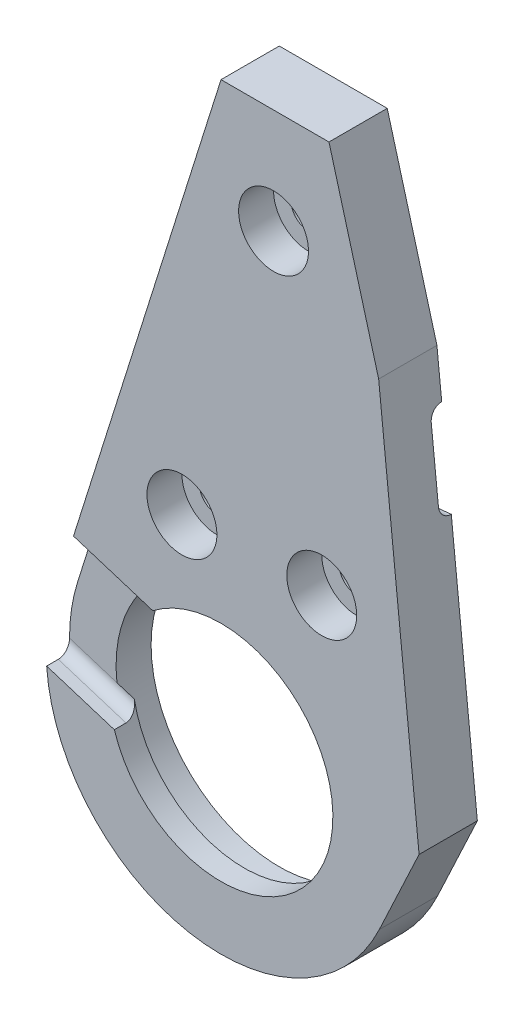
ISO-10303-21;
HEADER;
FILE_DESCRIPTION(('STEP AP214'),'2;1');
FILE_NAME('part.step','',(''),(''),'','','');
FILE_SCHEMA(('AUTOMOTIVE_DESIGN { 1 0 10303 214 1 1 1 1 }'));
ENDSEC;
DATA;
#1=APPLICATION_CONTEXT('core data for automotive mechanical design processes');
#2=APPLICATION_PROTOCOL_DEFINITION('international standard','automotive_design',2000,#1);
#3=PRODUCT_CONTEXT('',#1,'mechanical');
#4=PRODUCT('Part','Part','',(#3));
#5=PRODUCT_RELATED_PRODUCT_CATEGORY('part','',(#4));
#6=PRODUCT_DEFINITION_FORMATION('','',#4);
#7=PRODUCT_DEFINITION_CONTEXT('part definition',#1,'design');
#8=PRODUCT_DEFINITION('design','',#6,#7);
#9=PRODUCT_DEFINITION_SHAPE('','',#8);
#10=(LENGTH_UNIT() NAMED_UNIT(*) SI_UNIT(.MILLI.,.METRE.));
#11=(NAMED_UNIT(*) PLANE_ANGLE_UNIT() SI_UNIT($,.RADIAN.));
#12=(NAMED_UNIT(*) SI_UNIT($,.STERADIAN.) SOLID_ANGLE_UNIT());
#13=UNCERTAINTY_MEASURE_WITH_UNIT(LENGTH_MEASURE(1.E-05),#10,'distance_accuracy_value','');
#14=(GEOMETRIC_REPRESENTATION_CONTEXT(3) GLOBAL_UNCERTAINTY_ASSIGNED_CONTEXT((#13)) GLOBAL_UNIT_ASSIGNED_CONTEXT((#10,
#11,#12)) REPRESENTATION_CONTEXT('',''));
#15=CARTESIAN_POINT('',(0.,0.,0.));
#16=DIRECTION('',(0.,0.,1.));
#17=DIRECTION('',(1.,0.,0.));
#18=AXIS2_PLACEMENT_3D('',#15,#16,#17);
#19=CARTESIAN_POINT('',(-20.,-50.,-31.));
#20=DIRECTION('',(0.,0.,-1.));
#21=DIRECTION('',(-1.,0.,0.));
#22=AXIS2_PLACEMENT_3D('',#19,#20,#21);
#23=PLANE('',#22);
#24=CARTESIAN_POINT('',(-20.,-50.,-31.));
#25=DIRECTION('',(0.,0.,-1.));
#26=DIRECTION('',(-1.,0.,0.));
#27=AXIS2_PLACEMENT_3D('',#24,#25,#26);
#28=CIRCLE('',#27,9.6);
#29=CARTESIAN_POINT('',(-29.4393819294184,-51.7487334818578,-31.));
#30=VERTEX_POINT('',#29);
#31=CARTESIAN_POINT('',(-26.7393819294183,-43.1632806691053,-31.));
#32=VERTEX_POINT('',#31);
#33=EDGE_CURVE('E40',#30,#32,#28,.F.);
#34=ORIENTED_EDGE('',*,*,#33,.T.);
#35=DIRECTION('',(-0.953939201416946,0.3,0.));
#36=VECTOR('',#35,1.);
#37=CARTESIAN_POINT('',(22.058254426158,-58.5094273469315,-31.));
#38=LINE('',#37,#36);
#39=CARTESIAN_POINT('',(-28.2250979107265,-42.696044608641,-31.));
#40=VERTEX_POINT('',#39);
#41=EDGE_CURVE('E335',#32,#40,#38,.T.);
#42=ORIENTED_EDGE('',*,*,#41,.T.);
#43=CARTESIAN_POINT('',(-20.,-50.,-31.));
#44=DIRECTION('',(0.,0.,-1.));
#45=DIRECTION('',(-1.,0.,0.));
#46=AXIS2_PLACEMENT_3D('',#43,#44,#45);
#47=CIRCLE('',#46,11.);
#48=CARTESIAN_POINT('',(-30.9250979107266,-51.2814974213935,-31.));
#49=VERTEX_POINT('',#48);
#50=EDGE_CURVE('E384',#40,#49,#47,.T.);
#51=ORIENTED_EDGE('',*,*,#50,.T.);
#52=DIRECTION('',(-0.953939201416946,0.3,0.));
#53=VECTOR('',#52,1.);
#54=CARTESIAN_POINT('',(19.358254426158,-67.094880159684,-31.));
#55=LINE('',#54,#53);
#56=EDGE_CURVE('E53',#30,#49,#55,.T.);
#57=ORIENTED_EDGE('',*,*,#56,.F.);
#58=EDGE_LOOP('',(#34,#42,#51,#57));
#59=FACE_BOUND('',#58,.T.);
#60=ADVANCED_FACE('F36',(#59),#23,.T.);
#61=CARTESIAN_POINT('',(-20.,-50.,-60.));
#62=DIRECTION('',(0.,0.,1.));
#63=DIRECTION('',(1.,0.,0.));
#64=AXIS2_PLACEMENT_3D('',#61,#62,#63);
#65=CYLINDRICAL_SURFACE('',#64,9.6);
#66=CARTESIAN_POINT('',(-20.,-50.,-29.));
#67=DIRECTION('',(0.,0.,1.));
#68=DIRECTION('',(1.,0.,0.));
#69=AXIS2_PLACEMENT_3D('',#66,#67,#68);
#70=CIRCLE('',#69,9.6);
#71=CARTESIAN_POINT('',(-29.1558710353962,-52.8861783699543,-29.));
#72=VERTEX_POINT('',#71);
#73=CARTESIAN_POINT('',(-25.8558710353962,-42.3928471543679,-29.));
#74=VERTEX_POINT('',#73);
#75=EDGE_CURVE('E379',#72,#74,#70,.T.);
#76=ORIENTED_EDGE('',*,*,#75,.T.);
#77=DIRECTION('',(0.,0.,1.));
#78=VECTOR('',#77,1.);
#79=CARTESIAN_POINT('',(-25.8558710353962,-42.3928471543679,-60.));
#80=LINE('',#79,#78);
#81=CARTESIAN_POINT('',(-25.8558710353962,-42.392847154368,-30.));
#82=VERTEX_POINT('',#81);
#83=EDGE_CURVE('E182',#82,#74,#80,.T.);
#84=ORIENTED_EDGE('',*,*,#83,.F.);
#85=CARTESIAN_POINT('',(-26.7393819294183,-43.1632806691053,-31.));
#86=CARTESIAN_POINT('',(-26.708953104435,-43.1332824363248,-30.9999934591604));
#87=CARTESIAN_POINT('',(-26.6783480417263,-43.1035171265237,-30.9978619232937));
#88=CARTESIAN_POINT('',(-26.6170424007395,-43.0446745806458,-30.9894227469912));
#89=CARTESIAN_POINT('',(-26.586341808724,-43.0155974492457,-30.9831144754195));
#90=CARTESIAN_POINT('',(-26.4943659498825,-42.9296235328799,-30.9580008290302));
#91=CARTESIAN_POINT('',(-26.4333483392297,-42.874113842024,-30.9330072450578));
#92=CARTESIAN_POINT('',(-26.3237138627346,-42.7767576676922,-30.8721701775931));
#93=CARTESIAN_POINT('',(-26.2745972863862,-42.73410445976,-30.8384769358854));
#94=CARTESIAN_POINT('',(-26.1809863395571,-42.6543098408112,-30.760104370251));
#95=CARTESIAN_POINT('',(-26.1364802268708,-42.6171543190125,-30.7154539823377));
#96=CARTESIAN_POINT('',(-26.0638762374925,-42.5574808481338,-30.6272126941645));
#97=CARTESIAN_POINT('',(-26.0343572337536,-42.5335608163591,-30.5857323932424));
#98=CARTESIAN_POINT('',(-25.9807624535497,-42.4905619501602,-30.4970518295208));
#99=CARTESIAN_POINT('',(-25.9566869245982,-42.4714833358694,-30.4498513067738));
#100=CARTESIAN_POINT('',(-25.9152732084242,-42.4388989501857,-30.3502415033072));
#101=CARTESIAN_POINT('',(-25.8979941538528,-42.4254420301849,-30.2977912808445));
#102=CARTESIAN_POINT('',(-25.8718938975677,-42.4051896507866,-30.1896591472928));
#103=CARTESIAN_POINT('',(-25.8630474725039,-42.3983743239422,-30.1339874055727));
#104=CARTESIAN_POINT('',(-25.8578275418393,-42.3943536944394,-30.0649259233837));
#105=CARTESIAN_POINT('',(-25.8570939616421,-42.3937887322924,-30.0519499067012));
#106=CARTESIAN_POINT('',(-25.8561166134675,-42.3930361215307,-30.0259845921508));
#107=CARTESIAN_POINT('',(-25.8558722402626,-42.3928480066952,-30.0129953306092));
#108=CARTESIAN_POINT('',(-25.8558710353962,-42.3928471543679,-30.));
#109=B_SPLINE_CURVE_WITH_KNOTS('',3,(#85,#86,#87,#88,#89,#90,#91,#92,#93,#94,#95,#96,#97,#98,
#99,#100,#101,#102,#103,#104,#105,#106,#107,#108),.UNSPECIFIED.,.F.,.F.,(4,2,2,2,2,2,2,2,2,2,2,
4),(0.,0.128062400157063,0.256144155916194,0.512852722613334,0.731610673755789,0.9497970234836,
1.11788710607632,1.28598483015154,1.45551434343712,1.62453516057251,1.66355368064658,
1.70252389864426),.UNSPECIFIED.);
#110=EDGE_CURVE('E179',#32,#82,#109,.T.);
#111=ORIENTED_EDGE('',*,*,#110,.F.);
#112=ORIENTED_EDGE('',*,*,#33,.F.);
#113=CARTESIAN_POINT('',(-29.1558710353962,-52.8861783699543,-30.));
#114=CARTESIAN_POINT('',(-29.1558694981825,-52.8861810822079,-30.0247431489206));
#115=CARTESIAN_POINT('',(-29.156208220782,-52.8851089057417,-30.0494725114879));
#116=CARTESIAN_POINT('',(-29.157549089381,-52.8808509612997,-30.0987179073384));
#117=CARTESIAN_POINT('',(-29.1585508918658,-52.8776662877207,-30.1232340444259));
#118=CARTESIAN_POINT('',(-29.1625080213248,-52.8650528503457,-30.195895599995));
#119=CARTESIAN_POINT('',(-29.166415562616,-52.8525635613928,-30.2434913535337));
#120=CARTESIAN_POINT('',(-29.1764317266943,-52.8201741674065,-30.3356902574583));
#121=CARTESIAN_POINT('',(-29.1825366278895,-52.8002865906971,-30.3802983173884));
#122=CARTESIAN_POINT('',(-29.1965069068441,-52.7540593424347,-30.4657830378397));
#123=CARTESIAN_POINT('',(-29.2043746669144,-52.7277109351855,-30.5066545425771));
#124=CARTESIAN_POINT('',(-29.2220398813542,-52.6674027465966,-30.586938376665));
#125=CARTESIAN_POINT('',(-29.2319381452055,-52.633018666701,-30.626007912492));
#126=CARTESIAN_POINT('',(-29.2526848383426,-52.5591594082589,-30.6986694694454));
#127=CARTESIAN_POINT('',(-29.2635335440177,-52.5196827471983,-30.7322598890591));
#128=CARTESIAN_POINT('',(-29.2876329857231,-52.4294861268328,-30.7990271223231));
#129=CARTESIAN_POINT('',(-29.3009757534088,-52.3780004958367,-30.8311375327768));
#130=CARTESIAN_POINT('',(-29.3277321432008,-52.2707888228381,-30.8872654516292));
#131=CARTESIAN_POINT('',(-29.3411458174143,-52.2150590814562,-30.9112757983088));
#132=CARTESIAN_POINT('',(-29.3694454593169,-52.0923570146426,-30.9537982945056));
#133=CARTESIAN_POINT('',(-29.3842659105742,-52.0249201257417,-30.9710240433074));
#134=CARTESIAN_POINT('',(-29.4127926070912,-51.8879548885575,-30.9941204049947));
#135=CARTESIAN_POINT('',(-29.4264996264197,-51.8184280401121,-30.999998972404));
#136=CARTESIAN_POINT('',(-29.4393819294183,-51.7487334818578,-31.));
#137=B_SPLINE_CURVE_WITH_KNOTS('',3,(#113,#114,#115,#116,#117,#118,#119,#120,#121,#122,#123,
#124,#125,#126,#127,#128,#129,#130,#131,#132,#133,#134,#135,#136),.UNSPECIFIED.,.F.,.F.,(4,2,2,
2,2,2,2,2,2,2,2,4),(0.,0.0741774489505457,0.148316499633982,0.295597564020698,0.44263034837933,
0.589863042885926,0.748205012196815,0.906593181298909,1.09224427613172,1.27805908789319,
1.49058303425076,1.70295794433287),.UNSPECIFIED.);
#138=CARTESIAN_POINT('',(-29.1558710353962,-52.8861783699543,-30.));
#139=VERTEX_POINT('',#138);
#140=EDGE_CURVE('E159',#139,#30,#137,.T.);
#141=ORIENTED_EDGE('',*,*,#140,.F.);
#142=DIRECTION('',(0.,0.,1.));
#143=VECTOR('',#142,1.);
#144=CARTESIAN_POINT('',(-29.1558710353962,-52.8861783699543,-60.));
#145=LINE('',#144,#143);
#146=EDGE_CURVE('E167',#72,#139,#145,.F.);
#147=ORIENTED_EDGE('',*,*,#146,.F.);
#148=EDGE_LOOP('',(#76,#84,#111,#112,#141,#147));
#149=FACE_BOUND('',#148,.T.);
#150=ADVANCED_FACE('F176',(#149),#65,.F.);
#151=CARTESIAN_POINT('',(-20.,-50.,43.448064082473));
#152=DIRECTION('',(0.,0.,-1.));
#153=DIRECTION('',(-1.,0.,0.));
#154=AXIS2_PLACEMENT_3D('',#151,#152,#153);
#155=CYLINDRICAL_SURFACE('',#154,15.);
#156=CARTESIAN_POINT('',(-35.,-50.,-31.));
#157=CARTESIAN_POINT('',(-35.0000146091624,-50.0618934252655,-31.0000324406078));
#158=CARTESIAN_POINT('',(-34.9996173264148,-50.1237688856559,-30.994772656085));
#159=CARTESIAN_POINT('',(-34.9981063748224,-50.2457885596002,-30.9740340516693));
#160=CARTESIAN_POINT('',(-34.9969925679375,-50.305932437227,-30.9585532626587));
#161=CARTESIAN_POINT('',(-34.9941553951178,-50.4227951455116,-30.9177290114465));
#162=CARTESIAN_POINT('',(-34.9924317509404,-50.4795123988944,-30.892381046744));
#163=CARTESIAN_POINT('',(-34.9885764254946,-50.5877967106704,-30.8324215746637));
#164=CARTESIAN_POINT('',(-34.986444865533,-50.6393652932656,-30.7978128200637));
#165=CARTESIAN_POINT('',(-34.982055432017,-50.7350400899605,-30.7206435726129));
#166=CARTESIAN_POINT('',(-34.979799620821,-50.7792366090757,-30.6781952184562));
#167=CARTESIAN_POINT('',(-34.9754155511114,-50.8593859843174,-30.5860817249478));
#168=CARTESIAN_POINT('',(-34.9732872857094,-50.8953392859273,-30.5364169758246));
#169=CARTESIAN_POINT('',(-34.9695468581534,-50.9557916678516,-30.4341500841833));
#170=CARTESIAN_POINT('',(-34.9679129685171,-50.9808061282078,-30.3818532428068));
#171=CARTESIAN_POINT('',(-34.9652259305991,-51.02099196968,-30.2736284140995));
#172=CARTESIAN_POINT('',(-34.9641718360279,-51.0361793967884,-30.2177065110609));
#173=CARTESIAN_POINT('',(-34.9631524929805,-51.0507548220827,-30.1343496040528));
#174=CARTESIAN_POINT('',(-34.9629063075052,-51.0542497643536,-30.1075821063431));
#175=CARTESIAN_POINT('',(-34.9625770191807,-51.0589108343465,-30.0538813810222));
#176=CARTESIAN_POINT('',(-34.9624936920082,-51.0600801654385,-30.0269484327081));
#177=CARTESIAN_POINT('',(-34.9624941314541,-51.0600798867073,-30.));
#178=B_SPLINE_CURVE_WITH_KNOTS('',3,(#156,#157,#158,#159,#160,#161,#162,#163,#164,#165,#166,
#167,#168,#169,#170,#171,#172,#173,#174,#175,#176,#177),.UNSPECIFIED.,.F.,.F.,(4,2,2,2,2,2,2,2,
2,2,4),(0.,0.185433339833314,0.370902414575588,0.556456220295377,0.741954931139815,
0.92498110236649,1.10799738008258,1.28108983741606,1.4538989440874,1.53479982440294,
1.6155891919015),.UNSPECIFIED.);
#179=CARTESIAN_POINT('',(-35.,-50.,-31.));
#180=VERTEX_POINT('',#179);
#181=CARTESIAN_POINT('',(-34.9624941314541,-51.0600798867073,-30.));
#182=VERTEX_POINT('',#181);
#183=EDGE_CURVE('E161',#180,#182,#178,.T.);
#184=ORIENTED_EDGE('',*,*,#183,.F.);
#185=CARTESIAN_POINT('',(-20.,-50.,-31.));
#186=DIRECTION('',(0.,0.,-1.));
#187=DIRECTION('',(0.,1.,0.));
#188=AXIS2_PLACEMENT_3D('',#185,#186,#187);
#189=CIRCLE('',#188,15.);
#190=CARTESIAN_POINT('',(-34.3090880212542,-45.5,-31.));
#191=VERTEX_POINT('',#190);
#192=EDGE_CURVE('E173',#191,#180,#189,.F.);
#193=ORIENTED_EDGE('',*,*,#192,.F.);
#194=DIRECTION('',(0.,0.,-1.));
#195=VECTOR('',#194,1.);
#196=CARTESIAN_POINT('',(-34.3090880212542,-45.5,43.448064082473));
#197=LINE('',#196,#195);
#198=CARTESIAN_POINT('',(-34.3090880212542,-45.5,-34.));
#199=VERTEX_POINT('',#198);
#200=EDGE_CURVE('E346',#191,#199,#197,.T.);
#201=ORIENTED_EDGE('',*,*,#200,.T.);
#202=CARTESIAN_POINT('',(-20.,-50.,-34.));
#203=DIRECTION('',(0.,0.,1.));
#204=DIRECTION('',(1.,0.,0.));
#205=AXIS2_PLACEMENT_3D('',#202,#203,#204);
#206=CIRCLE('',#205,15.);
#207=CARTESIAN_POINT('',(-6.41777475793713,-56.3657801936503,-34.));
#208=VERTEX_POINT('',#207);
#209=EDGE_CURVE('E367',#199,#208,#206,.T.);
#210=ORIENTED_EDGE('',*,*,#209,.T.);
#211=DIRECTION('',(0.,0.,-1.));
#212=VECTOR('',#211,1.);
#213=CARTESIAN_POINT('',(-6.41777475793713,-56.3657801936503,43.448064082473));
#214=LINE('',#213,#212);
#215=CARTESIAN_POINT('',(-6.41777475793713,-56.3657801936503,-29.));
#216=VERTEX_POINT('',#215);
#217=EDGE_CURVE('E364',#216,#208,#214,.T.);
#218=ORIENTED_EDGE('',*,*,#217,.F.);
#219=CARTESIAN_POINT('',(-20.,-50.,-29.));
#220=DIRECTION('',(0.,0.,1.));
#221=DIRECTION('',(1.,0.,0.));
#222=AXIS2_PLACEMENT_3D('',#219,#220,#221);
#223=CIRCLE('',#222,15.);
#224=CARTESIAN_POINT('',(-34.9624941314541,-51.0600798867073,-29.));
#225=VERTEX_POINT('',#224);
#226=EDGE_CURVE('E355',#225,#216,#223,.T.);
#227=ORIENTED_EDGE('',*,*,#226,.F.);
#228=DIRECTION('',(0.,0.,-1.));
#229=VECTOR('',#228,1.);
#230=CARTESIAN_POINT('',(-34.9624941314541,-51.0600798867073,43.448064082473));
#231=LINE('',#230,#229);
#232=EDGE_CURVE('E298',#182,#225,#231,.F.);
#233=ORIENTED_EDGE('',*,*,#232,.F.);
#234=EDGE_LOOP('',(#184,#193,#201,#210,#218,#227,#233));
#235=FACE_BOUND('',#234,.T.);
#236=ADVANCED_FACE('F266',(#235),#155,.T.);
#237=CARTESIAN_POINT('',(-3.00434421209489,-49.0827793498556,43.448064082473));
#238=DIRECTION('',(-0.905481682804191,0.424385346243353,0.));
#239=DIRECTION('',(-0.424385346243353,-0.905481682804191,0.));
#240=AXIS2_PLACEMENT_3D('',#237,#238,#239);
#241=PLANE('',#240);
#242=DIRECTION('',(0.424385346243353,0.905481682804191,0.));
#243=VECTOR('',#242,1.);
#244=CARTESIAN_POINT('',(-3.00434421209489,-49.0827793498556,-29.));
#245=LINE('',#244,#243);
#246=CARTESIAN_POINT('',(-3.00434421209489,-49.0827793498556,-29.));
#247=VERTEX_POINT('',#246);
#248=EDGE_CURVE('E358',#216,#247,#245,.T.);
#249=ORIENTED_EDGE('',*,*,#248,.F.);
#250=ORIENTED_EDGE('',*,*,#217,.T.);
#251=DIRECTION('',(0.424385346243353,0.905481682804191,0.));
#252=VECTOR('',#251,1.);
#253=CARTESIAN_POINT('',(-3.00434421209489,-49.0827793498556,-34.));
#254=LINE('',#253,#252);
#255=CARTESIAN_POINT('',(-3.00434421209489,-49.0827793498556,-34.));
#256=VERTEX_POINT('',#255);
#257=EDGE_CURVE('E366',#208,#256,#254,.T.);
#258=ORIENTED_EDGE('',*,*,#257,.T.);
#259=DIRECTION('',(0.,0.,-1.));
#260=VECTOR('',#259,1.);
#261=CARTESIAN_POINT('',(-3.00434421209489,-49.0827793498556,43.448064082473));
#262=LINE('',#261,#260);
#263=EDGE_CURVE('E368',#247,#256,#262,.T.);
#264=ORIENTED_EDGE('',*,*,#263,.F.);
#265=EDGE_LOOP('',(#249,#250,#258,#264));
#266=FACE_BOUND('',#265,.T.);
#267=ADVANCED_FACE('F286',(#266),#241,.F.);
#268=CARTESIAN_POINT('',(-6.47298154426952,-15.4820474382701,43.448064082473));
#269=DIRECTION('',(-0.994713891574881,-0.102685314957669,0.));
#270=DIRECTION('',(0.102685314957669,-0.994713891574881,0.));
#271=AXIS2_PLACEMENT_3D('',#268,#269,#270);
#272=PLANE('',#271);
#273=DIRECTION('',(-0.102685314957669,0.994713891574881,0.));
#274=VECTOR('',#273,1.);
#275=CARTESIAN_POINT('',(-6.47298154426952,-15.4820474382701,-34.));
#276=LINE('',#275,#274);
#277=CARTESIAN_POINT('',(-5.24075776477749,-27.4186141371687,-34.));
#278=VERTEX_POINT('',#277);
#279=EDGE_CURVE('E375',#256,#278,#276,.T.);
#280=ORIENTED_EDGE('',*,*,#279,.T.);
#281=CARTESIAN_POINT('',(-5.34344307973516,-26.4239002455938,-34.));
#282=DIRECTION('',(0.994713891574881,0.102685314957669,0.));
#283=DIRECTION('',(0.102685314957669,-0.994713891574881,0.));
#284=AXIS2_PLACEMENT_3D('',#281,#282,#283);
#285=CIRCLE('',#284,1.);
#286=CARTESIAN_POINT('',(-5.34344307973516,-26.4239002455938,-33.));
#287=VERTEX_POINT('',#286);
#288=EDGE_CURVE('E415',#287,#278,#285,.T.);
#289=ORIENTED_EDGE('',*,*,#288,.F.);
#290=DIRECTION('',(-0.102685314957669,0.994713891574881,0.));
#291=VECTOR('',#290,1.);
#292=CARTESIAN_POINT('',(-5.24075776477749,-27.4186141371687,-33.));
#293=LINE('',#292,#291);
#294=CARTESIAN_POINT('',(-5.95955496948118,-20.4556168961445,-33.));
#295=VERTEX_POINT('',#294);
#296=EDGE_CURVE('E441',#287,#295,#293,.T.);
#297=ORIENTED_EDGE('',*,*,#296,.T.);
#298=CARTESIAN_POINT('',(-5.95955496948118,-20.4556168961445,-34.));
#299=DIRECTION('',(0.994713891574881,0.102685314957669,0.));
#300=DIRECTION('',(0.102685314957669,-0.994713891574881,0.));
#301=AXIS2_PLACEMENT_3D('',#298,#299,#300);
#302=CIRCLE('',#301,1.);
#303=CARTESIAN_POINT('',(-6.06224028443885,-19.4609030045697,-34.));
#304=VERTEX_POINT('',#303);
#305=EDGE_CURVE('E489',#304,#295,#302,.T.);
#306=ORIENTED_EDGE('',*,*,#305,.F.);
#307=CARTESIAN_POINT('',(-6.47298154426952,-15.4820474382701,-34.));
#308=VERTEX_POINT('',#307);
#309=EDGE_CURVE('E370',#304,#308,#276,.T.);
#310=ORIENTED_EDGE('',*,*,#309,.T.);
#311=DIRECTION('',(0.,0.,-1.));
#312=VECTOR('',#311,1.);
#313=CARTESIAN_POINT('',(-6.47298154426952,-15.4820474382701,43.448064082473));
#314=LINE('',#313,#312);
#315=CARTESIAN_POINT('',(-6.47298154426952,-15.4820474382701,-29.));
#316=VERTEX_POINT('',#315);
#317=EDGE_CURVE('E371',#316,#308,#314,.T.);
#318=ORIENTED_EDGE('',*,*,#317,.F.);
#319=DIRECTION('',(-0.102685314957669,0.994713891574881,0.));
#320=VECTOR('',#319,1.);
#321=CARTESIAN_POINT('',(-6.47298154426952,-15.4820474382701,-29.));
#322=LINE('',#321,#320);
#323=EDGE_CURVE('E398',#247,#316,#322,.T.);
#324=ORIENTED_EDGE('',*,*,#323,.F.);
#325=ORIENTED_EDGE('',*,*,#263,.T.);
#326=EDGE_LOOP('',(#280,#289,#297,#306,#310,#318,#324,#325));
#327=FACE_BOUND('',#326,.T.);
#328=ADVANCED_FACE('F282',(#327),#272,.F.);
#329=CARTESIAN_POINT('',(-10.7364907721348,0.,43.448064082473));
#330=DIRECTION('',(-0.964110662190105,-0.265500717609871,0.));
#331=DIRECTION('',(0.265500717609871,-0.964110662190105,0.));
#332=AXIS2_PLACEMENT_3D('',#329,#330,#331);
#333=PLANE('',#332);
#334=DIRECTION('',(-0.265500717609871,0.964110662190105,0.));
#335=VECTOR('',#334,1.);
#336=CARTESIAN_POINT('',(-10.7364907721348,0.,-29.));
#337=LINE('',#336,#335);
#338=CARTESIAN_POINT('',(-10.7364907721348,0.,-29.));
#339=VERTEX_POINT('',#338);
#340=EDGE_CURVE('E45',#316,#339,#337,.T.);
#341=ORIENTED_EDGE('',*,*,#340,.F.);
#342=ORIENTED_EDGE('',*,*,#317,.T.);
#343=DIRECTION('',(-0.265500717609871,0.964110662190105,0.));
#344=VECTOR('',#343,1.);
#345=CARTESIAN_POINT('',(-10.7364907721348,0.,-34.));
#346=LINE('',#345,#344);
#347=CARTESIAN_POINT('',(-10.7364907721348,0.,-34.));
#348=VERTEX_POINT('',#347);
#349=EDGE_CURVE('E374',#308,#348,#346,.T.);
#350=ORIENTED_EDGE('',*,*,#349,.T.);
#351=DIRECTION('',(0.,0.,-1.));
#352=VECTOR('',#351,1.);
#353=CARTESIAN_POINT('',(-10.7364907721348,0.,43.448064082473));
#354=LINE('',#353,#352);
#355=EDGE_CURVE('E376',#339,#348,#354,.T.);
#356=ORIENTED_EDGE('',*,*,#355,.F.);
#357=EDGE_LOOP('',(#341,#342,#350,#356));
#358=FACE_BOUND('',#357,.T.);
#359=ADVANCED_FACE('F278',(#358),#333,.F.);
#360=CARTESIAN_POINT('',(-20.,0.,43.448064082473));
#361=DIRECTION('',(0.,-1.,0.));
#362=DIRECTION('',(0.,0.,-1.));
#363=AXIS2_PLACEMENT_3D('',#360,#361,#362);
#364=PLANE('',#363);
#365=DIRECTION('',(-1.,0.,0.));
#366=VECTOR('',#365,1.);
#367=CARTESIAN_POINT('',(-20.,0.,-29.));
#368=LINE('',#367,#366);
#369=CARTESIAN_POINT('',(-20.,0.,-29.));
#370=VERTEX_POINT('',#369);
#371=EDGE_CURVE('E11',#339,#370,#368,.T.);
#372=ORIENTED_EDGE('',*,*,#371,.F.);
#373=ORIENTED_EDGE('',*,*,#355,.T.);
#374=DIRECTION('',(-1.,0.,0.));
#375=VECTOR('',#374,1.);
#376=CARTESIAN_POINT('',(-20.,0.,-34.));
#377=LINE('',#376,#375);
#378=CARTESIAN_POINT('',(-20.,0.,-34.));
#379=VERTEX_POINT('',#378);
#380=EDGE_CURVE('E378',#348,#379,#377,.T.);
#381=ORIENTED_EDGE('',*,*,#380,.T.);
#382=DIRECTION('',(0.,0.,-1.));
#383=VECTOR('',#382,1.);
#384=CARTESIAN_POINT('',(-20.,0.,43.448064082473));
#385=LINE('',#384,#383);
#386=EDGE_CURVE('E360',#370,#379,#385,.T.);
#387=ORIENTED_EDGE('',*,*,#386,.F.);
#388=EDGE_LOOP('',(#372,#373,#381,#387));
#389=FACE_BOUND('',#388,.T.);
#390=ADVANCED_FACE('F274',(#389),#364,.F.);
#391=CARTESIAN_POINT('',(-34.3090880212542,-45.5,43.448064082473));
#392=DIRECTION('',(0.953939201416946,-0.3,0.));
#393=DIRECTION('',(0.3,0.953939201416946,0.));
#394=AXIS2_PLACEMENT_3D('',#391,#392,#393);
#395=PLANE('',#394);
#396=CARTESIAN_POINT('',(-32.9590880212542,-41.2072735936237,-30.));
#397=DIRECTION('',(-0.953939201416946,0.3,0.));
#398=DIRECTION('',(0.3,0.953939201416946,0.));
#399=AXIS2_PLACEMENT_3D('',#396,#397,#398);
#400=CIRCLE('',#399,1.);
#401=CARTESIAN_POINT('',(-32.6590880212542,-40.2533343922068,-30.));
#402=VERTEX_POINT('',#401);
#403=CARTESIAN_POINT('',(-32.9590880212542,-41.2072735936237,-31.));
#404=VERTEX_POINT('',#403);
#405=EDGE_CURVE('E339',#402,#404,#400,.T.);
#406=ORIENTED_EDGE('',*,*,#405,.F.);
#407=DIRECTION('',(0.,0.,-1.));
#408=VECTOR('',#407,1.);
#409=CARTESIAN_POINT('',(-32.6590880212542,-40.2533343922068,-30.));
#410=LINE('',#409,#408);
#411=CARTESIAN_POINT('',(-32.6590880212542,-40.2533343922068,-29.));
#412=VERTEX_POINT('',#411);
#413=EDGE_CURVE('E343',#412,#402,#410,.T.);
#414=ORIENTED_EDGE('',*,*,#413,.F.);
#415=DIRECTION('',(-0.3,-0.953939201416946,0.));
#416=VECTOR('',#415,1.);
#417=CARTESIAN_POINT('',(-34.3090880212542,-45.5,-29.));
#418=LINE('',#417,#416);
#419=EDGE_CURVE('E351',#370,#412,#418,.T.);
#420=ORIENTED_EDGE('',*,*,#419,.F.);
#421=ORIENTED_EDGE('',*,*,#386,.T.);
#422=DIRECTION('',(-0.3,-0.953939201416946,0.));
#423=VECTOR('',#422,1.);
#424=CARTESIAN_POINT('',(-34.3090880212542,-45.5,-34.));
#425=LINE('',#424,#423);
#426=EDGE_CURVE('E356',#379,#199,#425,.T.);
#427=ORIENTED_EDGE('',*,*,#426,.T.);
#428=ORIENTED_EDGE('',*,*,#200,.F.);
#429=DIRECTION('',(-0.3,-0.953939201416946,0.));
#430=VECTOR('',#429,1.);
#431=CARTESIAN_POINT('',(-35.6590880212542,-49.7927264063762,-31.));
#432=LINE('',#431,#430);
#433=EDGE_CURVE('E331',#404,#191,#432,.T.);
#434=ORIENTED_EDGE('',*,*,#433,.F.);
#435=EDGE_LOOP('',(#406,#414,#420,#421,#427,#428,#434));
#436=FACE_BOUND('',#435,.T.);
#437=ADVANCED_FACE('F270',(#436),#395,.F.);
#438=CARTESIAN_POINT('',(-20.,-50.,-34.));
#439=DIRECTION('',(0.,0.,1.));
#440=DIRECTION('',(1.,0.,0.));
#441=AXIS2_PLACEMENT_3D('',#438,#439,#440);
#442=PLANE('',#441);
#443=CARTESIAN_POINT('',(-11.3545114775101,-34.,-34.));
#444=DIRECTION('',(0.,0.,-1.));
#445=DIRECTION('',(-1.,0.,0.));
#446=AXIS2_PLACEMENT_3D('',#443,#444,#445);
#447=CIRCLE('',#446,1.5);
#448=CARTESIAN_POINT('',(-12.8545114775101,-34.,-34.));
#449=VERTEX_POINT('',#448);
#450=EDGE_CURVE('E443',#449,#449,#447,.T.);
#451=ORIENTED_EDGE('',*,*,#450,.F.);
#452=EDGE_LOOP('',(#451));
#453=FACE_BOUND('',#452,.T.);
#454=CARTESIAN_POINT('',(-23.3545114775101,-34.,-34.));
#455=DIRECTION('',(0.,0.,-1.));
#456=DIRECTION('',(-1.,0.,0.));
#457=AXIS2_PLACEMENT_3D('',#454,#455,#456);
#458=CIRCLE('',#457,1.5);
#459=CARTESIAN_POINT('',(-24.8545114775101,-34.,-34.));
#460=VERTEX_POINT('',#459);
#461=EDGE_CURVE('E455',#460,#460,#458,.T.);
#462=ORIENTED_EDGE('',*,*,#461,.F.);
#463=EDGE_LOOP('',(#462));
#464=FACE_BOUND('',#463,.T.);
#465=CARTESIAN_POINT('',(-15.4923752020958,-9.,-34.));
#466=DIRECTION('',(0.,0.,-1.));
#467=DIRECTION('',(-1.,0.,0.));
#468=AXIS2_PLACEMENT_3D('',#465,#466,#467);
#469=CIRCLE('',#468,1.5);
#470=CARTESIAN_POINT('',(-16.9923752020958,-9.,-34.));
#471=VERTEX_POINT('',#470);
#472=EDGE_CURVE('E467',#471,#471,#469,.T.);
#473=ORIENTED_EDGE('',*,*,#472,.F.);
#474=EDGE_LOOP('',(#473));
#475=FACE_BOUND('',#474,.T.);
#476=CARTESIAN_POINT('',(-20.,-50.,-34.));
#477=DIRECTION('',(0.,0.,-1.));
#478=DIRECTION('',(-1.,0.,0.));
#479=AXIS2_PLACEMENT_3D('',#476,#477,#478);
#480=CIRCLE('',#479,11.);
#481=CARTESIAN_POINT('',(-31.,-50.,-34.));
#482=VERTEX_POINT('',#481);
#483=EDGE_CURVE('E386',#482,#482,#480,.T.);
#484=ORIENTED_EDGE('',*,*,#483,.F.);
#485=EDGE_LOOP('',(#484));
#486=FACE_BOUND('',#485,.T.);
#487=DIRECTION('',(0.102685314957669,-0.994713891574881,0.));
#488=VECTOR('',#487,1.);
#489=CARTESIAN_POINT('',(-13.1984688973765,-28.2400966568301,-34.));
#490=LINE('',#489,#488);
#491=CARTESIAN_POINT('',(-14.0199514170379,-20.282385524231,-34.));
#492=VERTEX_POINT('',#491);
#493=CARTESIAN_POINT('',(-13.1984688973765,-28.2400966568301,-34.));
#494=VERTEX_POINT('',#493);
#495=EDGE_CURVE('E61',#492,#494,#490,.T.);
#496=ORIENTED_EDGE('',*,*,#495,.T.);
#497=DIRECTION('',(0.994713891574881,0.102685314957669,0.));
#498=VECTOR('',#497,1.);
#499=CARTESIAN_POINT('',(-13.1984688973765,-28.2400966568301,-34.));
#500=LINE('',#499,#498);
#501=EDGE_CURVE('E412',#494,#278,#500,.T.);
#502=ORIENTED_EDGE('',*,*,#501,.T.);
#503=ORIENTED_EDGE('',*,*,#279,.F.);
#504=ORIENTED_EDGE('',*,*,#257,.F.);
#505=ORIENTED_EDGE('',*,*,#209,.F.);
#506=ORIENTED_EDGE('',*,*,#426,.F.);
#507=ORIENTED_EDGE('',*,*,#380,.F.);
#508=ORIENTED_EDGE('',*,*,#349,.F.);
#509=ORIENTED_EDGE('',*,*,#309,.F.);
#510=DIRECTION('',(0.994713891574881,0.102685314957669,0.));
#511=VECTOR('',#510,1.);
#512=CARTESIAN_POINT('',(-14.0199514170379,-20.282385524231,-34.));
#513=LINE('',#512,#511);
#514=EDGE_CURVE('E422',#492,#304,#513,.T.);
#515=ORIENTED_EDGE('',*,*,#514,.F.);
#516=EDGE_LOOP('',(#496,#502,#503,#504,#505,#506,#507,#508,#509,#515));
#517=FACE_BOUND('',#516,.T.);
#518=ADVANCED_FACE('F267',(#453,#464,#475,#486,#517),#442,.F.);
#519=CARTESIAN_POINT('',(-92.9342149240722,-29.8369153763038,-29.));
#520=DIRECTION('',(0.,0.,1.));
#521=DIRECTION('',(1.,0.,0.));
#522=AXIS2_PLACEMENT_3D('',#519,#520,#521);
#523=PLANE('',#522);
#524=DIRECTION('',(-0.953939201416946,0.3,0.));
#525=VECTOR('',#524,1.);
#526=CARTESIAN_POINT('',(22.358254426158,-57.5554881455146,-29.));
#527=LINE('',#526,#525);
#528=EDGE_CURVE('E342',#74,#412,#527,.T.);
#529=ORIENTED_EDGE('',*,*,#528,.F.);
#530=ORIENTED_EDGE('',*,*,#75,.F.);
#531=DIRECTION('',(-0.953939201416946,0.3,0.));
#532=VECTOR('',#531,1.);
#533=CARTESIAN_POINT('',(19.058254426158,-68.048819361101,-29.));
#534=LINE('',#533,#532);
#535=EDGE_CURVE('E164',#72,#225,#534,.T.);
#536=ORIENTED_EDGE('',*,*,#535,.T.);
#537=ORIENTED_EDGE('',*,*,#226,.T.);
#538=ORIENTED_EDGE('',*,*,#248,.T.);
#539=ORIENTED_EDGE('',*,*,#323,.T.);
#540=ORIENTED_EDGE('',*,*,#340,.T.);
#541=ORIENTED_EDGE('',*,*,#371,.T.);
#542=ORIENTED_EDGE('',*,*,#419,.T.);
#543=EDGE_LOOP('',(#529,#530,#536,#537,#538,#539,#540,#541,#542));
#544=FACE_BOUND('',#543,.T.);
#545=CARTESIAN_POINT('',(-11.3545114775101,-34.,-29.));
#546=DIRECTION('',(0.,0.,-1.));
#547=DIRECTION('',(-1.,0.,0.));
#548=AXIS2_PLACEMENT_3D('',#545,#546,#547);
#549=CIRCLE('',#548,3.);
#550=CARTESIAN_POINT('',(-14.3545114775101,-34.,-29.));
#551=VERTEX_POINT('',#550);
#552=EDGE_CURVE('E446',#551,#551,#549,.T.);
#553=ORIENTED_EDGE('',*,*,#552,.T.);
#554=EDGE_LOOP('',(#553));
#555=FACE_BOUND('',#554,.T.);
#556=CARTESIAN_POINT('',(-23.3545114775101,-34.,-29.));
#557=DIRECTION('',(0.,0.,-1.));
#558=DIRECTION('',(-1.,0.,0.));
#559=AXIS2_PLACEMENT_3D('',#556,#557,#558);
#560=CIRCLE('',#559,3.);
#561=CARTESIAN_POINT('',(-26.3545114775102,-34.,-29.));
#562=VERTEX_POINT('',#561);
#563=EDGE_CURVE('E458',#562,#562,#560,.T.);
#564=ORIENTED_EDGE('',*,*,#563,.T.);
#565=EDGE_LOOP('',(#564));
#566=FACE_BOUND('',#565,.T.);
#567=CARTESIAN_POINT('',(-15.4923752020958,-9.,-29.));
#568=DIRECTION('',(0.,0.,-1.));
#569=DIRECTION('',(-1.,0.,0.));
#570=AXIS2_PLACEMENT_3D('',#567,#568,#569);
#571=CIRCLE('',#570,3.);
#572=CARTESIAN_POINT('',(-18.4923752020958,-9.,-29.));
#573=VERTEX_POINT('',#572);
#574=EDGE_CURVE('E470',#573,#573,#571,.T.);
#575=ORIENTED_EDGE('',*,*,#574,.T.);
#576=EDGE_LOOP('',(#575));
#577=FACE_BOUND('',#576,.T.);
#578=ADVANCED_FACE('F38',(#544,#555,#566,#577),#523,.T.);
#579=CARTESIAN_POINT('',(-20.,-50.,-31.));
#580=DIRECTION('',(0.,0.,-1.));
#581=DIRECTION('',(-1.,0.,0.));
#582=AXIS2_PLACEMENT_3D('',#579,#580,#581);
#583=CYLINDRICAL_SURFACE('',#582,11.);
#584=ORIENTED_EDGE('',*,*,#50,.F.);
#585=EDGE_CURVE('E333',#49,#40,#47,.T.);
#586=ORIENTED_EDGE('',*,*,#585,.F.);
#587=EDGE_LOOP('',(#584,#586));
#588=FACE_BOUND('',#587,.T.);
#589=ORIENTED_EDGE('',*,*,#483,.T.);
#590=EDGE_LOOP('',(#589));
#591=FACE_BOUND('',#590,.T.);
#592=ADVANCED_FACE('F256',(#588,#591),#583,.F.);
#593=CARTESIAN_POINT('',(-15.4923752020958,-9.,-32.));
#594=DIRECTION('',(0.,0.,1.));
#595=DIRECTION('',(-1.,0.,0.));
#596=AXIS2_PLACEMENT_3D('',#593,#594,#595);
#597=CYLINDRICAL_SURFACE('',#596,3.);
#598=CARTESIAN_POINT('',(-15.4923752020958,-9.,-32.));
#599=DIRECTION('',(0.,0.,-1.));
#600=DIRECTION('',(-1.,0.,0.));
#601=AXIS2_PLACEMENT_3D('',#598,#599,#600);
#602=CIRCLE('',#601,3.);
#603=CARTESIAN_POINT('',(-18.4923752020958,-9.,-32.));
#604=VERTEX_POINT('',#603);
#605=EDGE_CURVE('E476',#604,#604,#602,.T.);
#606=ORIENTED_EDGE('',*,*,#605,.T.);
#607=EDGE_LOOP('',(#606));
#608=FACE_BOUND('',#607,.T.);
#609=ORIENTED_EDGE('',*,*,#574,.F.);
#610=EDGE_LOOP('',(#609));
#611=FACE_BOUND('',#610,.T.);
#612=ADVANCED_FACE('F252',(#608,#611),#597,.F.);
#613=CARTESIAN_POINT('',(-15.4923752020958,-9.,-32.));
#614=DIRECTION('',(0.,0.,1.));
#615=DIRECTION('',(-1.,0.,0.));
#616=AXIS2_PLACEMENT_3D('',#613,#614,#615);
#617=PLANE('',#616);
#618=CARTESIAN_POINT('',(-15.4923752020958,-9.,-32.));
#619=DIRECTION('',(0.,0.,-1.));
#620=DIRECTION('',(-1.,0.,0.));
#621=AXIS2_PLACEMENT_3D('',#618,#619,#620);
#622=CIRCLE('',#621,1.5);
#623=CARTESIAN_POINT('',(-16.9923752020958,-9.,-32.));
#624=VERTEX_POINT('',#623);
#625=EDGE_CURVE('E473',#624,#624,#622,.T.);
#626=ORIENTED_EDGE('',*,*,#625,.T.);
#627=EDGE_LOOP('',(#626));
#628=FACE_BOUND('',#627,.T.);
#629=ORIENTED_EDGE('',*,*,#605,.F.);
#630=EDGE_LOOP('',(#629));
#631=FACE_BOUND('',#630,.T.);
#632=ADVANCED_FACE('F248',(#628,#631),#617,.T.);
#633=CARTESIAN_POINT('',(-15.4923752020958,-9.,-44.));
#634=DIRECTION('',(0.,0.,1.));
#635=DIRECTION('',(-1.,0.,0.));
#636=AXIS2_PLACEMENT_3D('',#633,#634,#635);
#637=CYLINDRICAL_SURFACE('',#636,1.5);
#638=ORIENTED_EDGE('',*,*,#625,.F.);
#639=EDGE_LOOP('',(#638));
#640=FACE_BOUND('',#639,.T.);
#641=ORIENTED_EDGE('',*,*,#472,.T.);
#642=EDGE_LOOP('',(#641));
#643=FACE_BOUND('',#642,.T.);
#644=ADVANCED_FACE('F244',(#640,#643),#637,.F.);
#645=CARTESIAN_POINT('',(-23.3545114775101,-34.,-32.));
#646=DIRECTION('',(0.,0.,1.));
#647=DIRECTION('',(-1.,0.,0.));
#648=AXIS2_PLACEMENT_3D('',#645,#646,#647);
#649=CYLINDRICAL_SURFACE('',#648,3.);
#650=CARTESIAN_POINT('',(-23.3545114775101,-34.,-32.));
#651=DIRECTION('',(0.,0.,-1.));
#652=DIRECTION('',(-1.,0.,0.));
#653=AXIS2_PLACEMENT_3D('',#650,#651,#652);
#654=CIRCLE('',#653,3.);
#655=CARTESIAN_POINT('',(-26.3545114775102,-34.,-32.));
#656=VERTEX_POINT('',#655);
#657=EDGE_CURVE('E464',#656,#656,#654,.T.);
#658=ORIENTED_EDGE('',*,*,#657,.T.);
#659=EDGE_LOOP('',(#658));
#660=FACE_BOUND('',#659,.T.);
#661=ORIENTED_EDGE('',*,*,#563,.F.);
#662=EDGE_LOOP('',(#661));
#663=FACE_BOUND('',#662,.T.);
#664=ADVANCED_FACE('F240',(#660,#663),#649,.F.);
#665=CARTESIAN_POINT('',(-23.3545114775101,-34.,-32.));
#666=DIRECTION('',(0.,0.,1.));
#667=DIRECTION('',(-1.,0.,0.));
#668=AXIS2_PLACEMENT_3D('',#665,#666,#667);
#669=PLANE('',#668);
#670=CARTESIAN_POINT('',(-23.3545114775101,-34.,-32.));
#671=DIRECTION('',(0.,0.,-1.));
#672=DIRECTION('',(-1.,0.,0.));
#673=AXIS2_PLACEMENT_3D('',#670,#671,#672);
#674=CIRCLE('',#673,1.5);
#675=CARTESIAN_POINT('',(-24.8545114775101,-34.,-32.));
#676=VERTEX_POINT('',#675);
#677=EDGE_CURVE('E461',#676,#676,#674,.T.);
#678=ORIENTED_EDGE('',*,*,#677,.T.);
#679=EDGE_LOOP('',(#678));
#680=FACE_BOUND('',#679,.T.);
#681=ORIENTED_EDGE('',*,*,#657,.F.);
#682=EDGE_LOOP('',(#681));
#683=FACE_BOUND('',#682,.T.);
#684=ADVANCED_FACE('F236',(#680,#683),#669,.T.);
#685=CARTESIAN_POINT('',(-23.3545114775101,-34.,-44.));
#686=DIRECTION('',(0.,0.,1.));
#687=DIRECTION('',(-1.,0.,0.));
#688=AXIS2_PLACEMENT_3D('',#685,#686,#687);
#689=CYLINDRICAL_SURFACE('',#688,1.5);
#690=ORIENTED_EDGE('',*,*,#677,.F.);
#691=EDGE_LOOP('',(#690));
#692=FACE_BOUND('',#691,.T.);
#693=ORIENTED_EDGE('',*,*,#461,.T.);
#694=EDGE_LOOP('',(#693));
#695=FACE_BOUND('',#694,.T.);
#696=ADVANCED_FACE('F232',(#692,#695),#689,.F.);
#697=CARTESIAN_POINT('',(-11.3545114775101,-34.,-32.));
#698=DIRECTION('',(0.,0.,1.));
#699=DIRECTION('',(-1.,0.,0.));
#700=AXIS2_PLACEMENT_3D('',#697,#698,#699);
#701=CYLINDRICAL_SURFACE('',#700,3.);
#702=CARTESIAN_POINT('',(-11.3545114775101,-34.,-32.));
#703=DIRECTION('',(0.,0.,-1.));
#704=DIRECTION('',(-1.,0.,0.));
#705=AXIS2_PLACEMENT_3D('',#702,#703,#704);
#706=CIRCLE('',#705,3.);
#707=CARTESIAN_POINT('',(-14.3545114775101,-34.,-32.));
#708=VERTEX_POINT('',#707);
#709=EDGE_CURVE('E452',#708,#708,#706,.T.);
#710=ORIENTED_EDGE('',*,*,#709,.T.);
#711=EDGE_LOOP('',(#710));
#712=FACE_BOUND('',#711,.T.);
#713=ORIENTED_EDGE('',*,*,#552,.F.);
#714=EDGE_LOOP('',(#713));
#715=FACE_BOUND('',#714,.T.);
#716=ADVANCED_FACE('F228',(#712,#715),#701,.F.);
#717=CARTESIAN_POINT('',(-11.3545114775101,-34.,-32.));
#718=DIRECTION('',(0.,0.,1.));
#719=DIRECTION('',(-1.,0.,0.));
#720=AXIS2_PLACEMENT_3D('',#717,#718,#719);
#721=PLANE('',#720);
#722=CARTESIAN_POINT('',(-11.3545114775101,-34.,-32.));
#723=DIRECTION('',(0.,0.,-1.));
#724=DIRECTION('',(-1.,0.,0.));
#725=AXIS2_PLACEMENT_3D('',#722,#723,#724);
#726=CIRCLE('',#725,1.5);
#727=CARTESIAN_POINT('',(-12.8545114775101,-34.,-32.));
#728=VERTEX_POINT('',#727);
#729=EDGE_CURVE('E449',#728,#728,#726,.T.);
#730=ORIENTED_EDGE('',*,*,#729,.T.);
#731=EDGE_LOOP('',(#730));
#732=FACE_BOUND('',#731,.T.);
#733=ORIENTED_EDGE('',*,*,#709,.F.);
#734=EDGE_LOOP('',(#733));
#735=FACE_BOUND('',#734,.T.);
#736=ADVANCED_FACE('F224',(#732,#735),#721,.T.);
#737=CARTESIAN_POINT('',(-11.3545114775101,-34.,-44.));
#738=DIRECTION('',(0.,0.,1.));
#739=DIRECTION('',(-1.,0.,0.));
#740=AXIS2_PLACEMENT_3D('',#737,#738,#739);
#741=CYLINDRICAL_SURFACE('',#740,1.5);
#742=ORIENTED_EDGE('',*,*,#729,.F.);
#743=EDGE_LOOP('',(#742));
#744=FACE_BOUND('',#743,.T.);
#745=ORIENTED_EDGE('',*,*,#450,.T.);
#746=EDGE_LOOP('',(#745));
#747=FACE_BOUND('',#746,.T.);
#748=ADVANCED_FACE('F220',(#744,#747),#741,.F.);
#749=CARTESIAN_POINT('',(-13.1984688973765,-28.2400966568301,-33.));
#750=DIRECTION('',(0.,0.,1.));
#751=DIRECTION('',(-1.,0.,0.));
#752=AXIS2_PLACEMENT_3D('',#749,#750,#751);
#753=PLANE('',#752);
#754=DIRECTION('',(-0.102685314957669,0.994713891574881,0.));
#755=VECTOR('',#754,1.);
#756=CARTESIAN_POINT('',(-13.1984688973765,-28.2400966568301,-33.));
#757=LINE('',#756,#755);
#758=CARTESIAN_POINT('',(-13.3011542123342,-27.2453827652552,-33.));
#759=VERTEX_POINT('',#758);
#760=CARTESIAN_POINT('',(-13.9172661020802,-21.2770994158059,-33.));
#761=VERTEX_POINT('',#760);
#762=EDGE_CURVE('E434',#759,#761,#757,.T.);
#763=ORIENTED_EDGE('',*,*,#762,.T.);
#764=DIRECTION('',(0.994713891574881,0.102685314957669,0.));
#765=VECTOR('',#764,1.);
#766=CARTESIAN_POINT('',(-13.9172661020802,-21.2770994158059,-33.));
#767=LINE('',#766,#765);
#768=EDGE_CURVE('E424',#295,#761,#767,.F.);
#769=ORIENTED_EDGE('',*,*,#768,.F.);
#770=ORIENTED_EDGE('',*,*,#296,.F.);
#771=DIRECTION('',(0.994713891574881,0.102685314957669,0.));
#772=VECTOR('',#771,1.);
#773=CARTESIAN_POINT('',(-5.34344307973516,-26.4239002455938,-33.));
#774=LINE('',#773,#772);
#775=EDGE_CURVE('E439',#759,#287,#774,.T.);
#776=ORIENTED_EDGE('',*,*,#775,.F.);
#777=EDGE_LOOP('',(#763,#769,#770,#776));
#778=FACE_BOUND('',#777,.T.);
#779=ADVANCED_FACE('F216',(#778),#753,.F.);
#780=CARTESIAN_POINT('',(-13.3011542123342,-27.2453827652552,-34.));
#781=DIRECTION('',(-0.994713891574881,-0.102685314957669,0.));
#782=DIRECTION('',(0.102685314957669,-0.994713891574881,0.));
#783=AXIS2_PLACEMENT_3D('',#780,#781,#782);
#784=CYLINDRICAL_SURFACE('',#783,1.);
#785=CARTESIAN_POINT('',(-13.3011542123342,-27.2453827652552,-34.));
#786=DIRECTION('',(0.994713891574881,0.102685314957669,0.));
#787=DIRECTION('',(0.102685314957669,-0.994713891574881,0.));
#788=AXIS2_PLACEMENT_3D('',#785,#786,#787);
#789=CIRCLE('',#788,1.);
#790=EDGE_CURVE('E426',#494,#759,#789,.F.);
#791=ORIENTED_EDGE('',*,*,#790,.T.);
#792=ORIENTED_EDGE('',*,*,#775,.T.);
#793=ORIENTED_EDGE('',*,*,#288,.T.);
#794=ORIENTED_EDGE('',*,*,#501,.F.);
#795=EDGE_LOOP('',(#791,#792,#793,#794));
#796=FACE_BOUND('',#795,.T.);
#797=ADVANCED_FACE('F213',(#796),#784,.F.);
#798=CARTESIAN_POINT('',(-15.9438149601237,-1.64589604576146,0.));
#799=DIRECTION('',(-0.994713891574881,-0.102685314957669,0.));
#800=DIRECTION('',(0.102685314957669,-0.994713891574881,0.));
#801=AXIS2_PLACEMENT_3D('',#798,#799,#800);
#802=PLANE('',#801);
#803=ORIENTED_EDGE('',*,*,#495,.F.);
#804=CARTESIAN_POINT('',(-13.9172661020802,-21.2770994158059,-34.));
#805=DIRECTION('',(0.994713891574881,0.102685314957669,0.));
#806=DIRECTION('',(0.102685314957669,-0.994713891574881,0.));
#807=AXIS2_PLACEMENT_3D('',#804,#805,#806);
#808=CIRCLE('',#807,1.);
#809=EDGE_CURVE('E429',#761,#492,#808,.F.);
#810=ORIENTED_EDGE('',*,*,#809,.F.);
#811=ORIENTED_EDGE('',*,*,#762,.F.);
#812=ORIENTED_EDGE('',*,*,#790,.F.);
#813=EDGE_LOOP('',(#803,#810,#811,#812));
#814=FACE_BOUND('',#813,.T.);
#815=ADVANCED_FACE('F209',(#814),#802,.F.);
#816=CARTESIAN_POINT('',(-13.9172661020802,-21.2770994158059,-34.));
#817=DIRECTION('',(-0.994713891574881,-0.102685314957669,0.));
#818=DIRECTION('',(0.102685314957669,-0.994713891574881,0.));
#819=AXIS2_PLACEMENT_3D('',#816,#817,#818);
#820=CYLINDRICAL_SURFACE('',#819,1.);
#821=ORIENTED_EDGE('',*,*,#809,.T.);
#822=ORIENTED_EDGE('',*,*,#514,.T.);
#823=ORIENTED_EDGE('',*,*,#305,.T.);
#824=ORIENTED_EDGE('',*,*,#768,.T.);
#825=EDGE_LOOP('',(#821,#822,#823,#824));
#826=FACE_BOUND('',#825,.T.);
#827=ADVANCED_FACE('F204',(#826),#820,.F.);
#828=CARTESIAN_POINT('',(19.358254426158,-67.094880159684,-31.));
#829=DIRECTION('',(0.,0.,-1.));
#830=DIRECTION('',(0.,1.,0.));
#831=AXIS2_PLACEMENT_3D('',#828,#829,#830);
#832=PLANE('',#831);
#833=EDGE_CURVE('E328',#40,#404,#38,.T.);
#834=ORIENTED_EDGE('',*,*,#833,.T.);
#835=ORIENTED_EDGE('',*,*,#433,.T.);
#836=ORIENTED_EDGE('',*,*,#192,.T.);
#837=EDGE_CURVE('E484',#49,#180,#55,.T.);
#838=ORIENTED_EDGE('',*,*,#837,.F.);
#839=ORIENTED_EDGE('',*,*,#585,.T.);
#840=EDGE_LOOP('',(#834,#835,#836,#838,#839));
#841=FACE_BOUND('',#840,.T.);
#842=ADVANCED_FACE('F208',(#841),#832,.F.);
#843=CARTESIAN_POINT('',(22.358254426158,-57.5554881455146,-30.));
#844=DIRECTION('',(0.3,0.953939201416946,0.));
#845=DIRECTION('',(-0.953939201416946,0.3,0.));
#846=AXIS2_PLACEMENT_3D('',#843,#844,#845);
#847=PLANE('',#846);
#848=ORIENTED_EDGE('',*,*,#83,.T.);
#849=ORIENTED_EDGE('',*,*,#528,.T.);
#850=ORIENTED_EDGE('',*,*,#413,.T.);
#851=DIRECTION('',(-0.953939201416946,0.3,0.));
#852=VECTOR('',#851,1.);
#853=CARTESIAN_POINT('',(22.358254426158,-57.5554881455146,-30.));
#854=LINE('',#853,#852);
#855=EDGE_CURVE('E336',#82,#402,#854,.T.);
#856=ORIENTED_EDGE('',*,*,#855,.F.);
#857=EDGE_LOOP('',(#848,#849,#850,#856));
#858=FACE_BOUND('',#857,.T.);
#859=ADVANCED_FACE('F203',(#858),#847,.F.);
#860=CARTESIAN_POINT('',(22.058254426158,-58.5094273469315,-30.));
#861=DIRECTION('',(-0.953939201416946,0.3,0.));
#862=DIRECTION('',(-0.3,-0.953939201416946,0.));
#863=AXIS2_PLACEMENT_3D('',#860,#861,#862);
#864=CYLINDRICAL_SURFACE('',#863,1.);
#865=ORIENTED_EDGE('',*,*,#110,.T.);
#866=ORIENTED_EDGE('',*,*,#855,.T.);
#867=ORIENTED_EDGE('',*,*,#405,.T.);
#868=ORIENTED_EDGE('',*,*,#833,.F.);
#869=ORIENTED_EDGE('',*,*,#41,.F.);
#870=EDGE_LOOP('',(#865,#866,#867,#868,#869));
#871=FACE_BOUND('',#870,.T.);
#872=ADVANCED_FACE('F313',(#871),#864,.F.);
#873=CARTESIAN_POINT('',(19.358254426158,-67.094880159684,-30.));
#874=DIRECTION('',(-0.953939201416946,0.3,0.));
#875=DIRECTION('',(-0.3,-0.953939201416946,0.));
#876=AXIS2_PLACEMENT_3D('',#873,#874,#875);
#877=CYLINDRICAL_SURFACE('',#876,1.);
#878=ORIENTED_EDGE('',*,*,#140,.T.);
#879=ORIENTED_EDGE('',*,*,#56,.T.);
#880=ORIENTED_EDGE('',*,*,#837,.T.);
#881=ORIENTED_EDGE('',*,*,#183,.T.);
#882=DIRECTION('',(-0.953939201416946,0.3,0.));
#883=VECTOR('',#882,1.);
#884=CARTESIAN_POINT('',(19.058254426158,-68.048819361101,-30.));
#885=LINE('',#884,#883);
#886=EDGE_CURVE('E155',#139,#182,#885,.T.);
#887=ORIENTED_EDGE('',*,*,#886,.F.);
#888=EDGE_LOOP('',(#878,#879,#880,#881,#887));
#889=FACE_BOUND('',#888,.T.);
#890=ADVANCED_FACE('F157',(#889),#877,.F.);
#891=CARTESIAN_POINT('',(19.058254426158,-68.048819361101,-30.));
#892=DIRECTION('',(-0.3,-0.953939201416946,0.));
#893=DIRECTION('',(0.953939201416946,-0.3,0.));
#894=AXIS2_PLACEMENT_3D('',#891,#892,#893);
#895=PLANE('',#894);
#896=ORIENTED_EDGE('',*,*,#146,.T.);
#897=ORIENTED_EDGE('',*,*,#886,.T.);
#898=ORIENTED_EDGE('',*,*,#232,.T.);
#899=ORIENTED_EDGE('',*,*,#535,.F.);
#900=EDGE_LOOP('',(#896,#897,#898,#899));
#901=FACE_BOUND('',#900,.T.);
#902=ADVANCED_FACE('F168',(#901),#895,.F.);
#903=CLOSED_SHELL('',(#60,#150,#236,#267,#328,#359,#390,#437,#518,#578,#592,#612,#632,#644,#664,
#684,#696,#716,#736,#748,#779,#797,#815,#827,#842,#859,#872,#890,#902));
#904=MANIFOLD_SOLID_BREP('B2',#903);
#905=ADVANCED_BREP_SHAPE_REPRESENTATION('',(#18,#904),#14);
#906=SHAPE_DEFINITION_REPRESENTATION(#9,#905);
ENDSEC;
END-ISO-10303-21;
